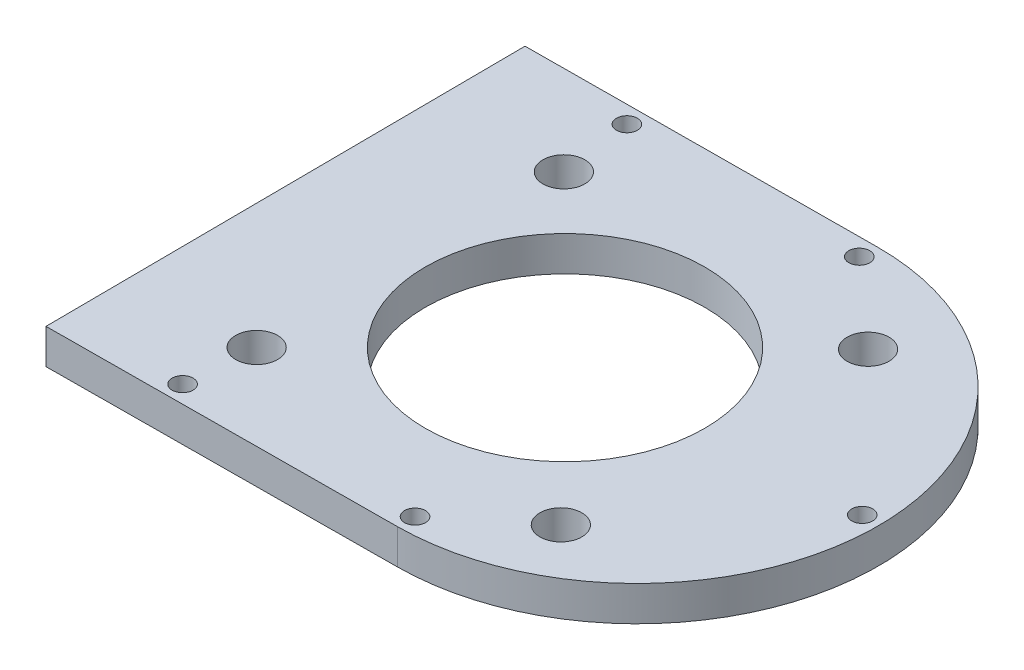
ISO-10303-21;
HEADER;
FILE_DESCRIPTION(('STEP AP214'),'2;1');
FILE_NAME('part.step','',(''),(''),'','','');
FILE_SCHEMA(('AUTOMOTIVE_DESIGN { 1 0 10303 214 1 1 1 1 }'));
ENDSEC;
DATA;
#1=APPLICATION_CONTEXT('core data for automotive mechanical design processes');
#2=APPLICATION_PROTOCOL_DEFINITION('international standard','automotive_design',2000,#1);
#3=PRODUCT_CONTEXT('',#1,'mechanical');
#4=PRODUCT('Part','Part','',(#3));
#5=PRODUCT_RELATED_PRODUCT_CATEGORY('part','',(#4));
#6=PRODUCT_DEFINITION_FORMATION('','',#4);
#7=PRODUCT_DEFINITION_CONTEXT('part definition',#1,'design');
#8=PRODUCT_DEFINITION('design','',#6,#7);
#9=PRODUCT_DEFINITION_SHAPE('','',#8);
#10=(LENGTH_UNIT() NAMED_UNIT(*) SI_UNIT(.MILLI.,.METRE.));
#11=(NAMED_UNIT(*) PLANE_ANGLE_UNIT() SI_UNIT($,.RADIAN.));
#12=(NAMED_UNIT(*) SI_UNIT($,.STERADIAN.) SOLID_ANGLE_UNIT());
#13=UNCERTAINTY_MEASURE_WITH_UNIT(LENGTH_MEASURE(1.E-05),#10,'distance_accuracy_value','');
#14=(GEOMETRIC_REPRESENTATION_CONTEXT(3) GLOBAL_UNCERTAINTY_ASSIGNED_CONTEXT((#13)) GLOBAL_UNIT_ASSIGNED_CONTEXT((#10,
#11,#12)) REPRESENTATION_CONTEXT('',''));
#15=CARTESIAN_POINT('',(0.,0.,0.));
#16=DIRECTION('',(0.,0.,1.));
#17=DIRECTION('',(1.,0.,0.));
#18=AXIS2_PLACEMENT_3D('',#15,#16,#17);
#19=CARTESIAN_POINT('',(1.24525927725289,5.,191.486792966765));
#20=DIRECTION('',(-0.00650297040088788,0.,-0.999978855464437));
#21=DIRECTION('',(-0.999978855464437,0.,0.00650297040088788));
#22=AXIS2_PLACEMENT_3D('',#19,#20,#21);
#23=PLANE('',#22);
#24=DIRECTION('',(0.999978855464437,0.,-0.00650297040088788));
#25=VECTOR('',#24,1.);
#26=CARTESIAN_POINT('',(1.24525927725289,0.,191.486792966765));
#27=LINE('',#26,#25);
#28=CARTESIAN_POINT('',(154.714766749302,0.,190.48876419938));
#29=VERTEX_POINT('',#28);
#30=CARTESIAN_POINT('',(204.713709522523,0.,190.163615679336));
#31=VERTEX_POINT('',#30);
#32=EDGE_CURVE('E130',#29,#31,#27,.T.);
#33=ORIENTED_EDGE('',*,*,#32,.T.);
#34=DIRECTION('',(0.,-1.,0.));
#35=VECTOR('',#34,1.);
#36=CARTESIAN_POINT('',(204.713709522523,5.,190.163615679336));
#37=LINE('',#36,#35);
#38=CARTESIAN_POINT('',(204.713709522523,5.,190.163615679336));
#39=VERTEX_POINT('',#38);
#40=EDGE_CURVE('E11',#39,#31,#37,.T.);
#41=ORIENTED_EDGE('',*,*,#40,.F.);
#42=DIRECTION('',(0.999978855464437,0.,-0.00650297040088788));
#43=VECTOR('',#42,1.);
#44=CARTESIAN_POINT('',(1.24525927725289,5.,191.486792966765));
#45=LINE('',#44,#43);
#46=CARTESIAN_POINT('',(154.714766749302,5.,190.48876419938));
#47=VERTEX_POINT('',#46);
#48=EDGE_CURVE('E88',#47,#39,#45,.T.);
#49=ORIENTED_EDGE('',*,*,#48,.F.);
#50=DIRECTION('',(0.,-1.,0.));
#51=VECTOR('',#50,1.);
#52=CARTESIAN_POINT('',(154.714766749302,5.,190.48876419938));
#53=LINE('',#52,#51);
#54=EDGE_CURVE('E114',#47,#29,#53,.T.);
#55=ORIENTED_EDGE('',*,*,#54,.T.);
#56=EDGE_LOOP('',(#33,#41,#49,#55));
#57=FACE_BOUND('',#56,.T.);
#58=ADVANCED_FACE('F35',(#57),#23,.F.);
#59=CARTESIAN_POINT('',(204.489357043693,5.,155.664345165813));
#60=DIRECTION('',(0.,-1.,0.));
#61=DIRECTION('',(0.,0.,-1.));
#62=AXIS2_PLACEMENT_3D('',#59,#60,#61);
#63=CYLINDRICAL_SURFACE('',#62,34.5);
#64=CARTESIAN_POINT('',(204.489357043693,0.,155.664345165813));
#65=DIRECTION('',(0.,1.,0.));
#66=DIRECTION('',(0.,0.,1.));
#67=AXIS2_PLACEMENT_3D('',#64,#65,#66);
#68=CIRCLE('',#67,34.5);
#69=CARTESIAN_POINT('',(204.265004564862,0.,121.16507465229));
#70=VERTEX_POINT('',#69);
#71=EDGE_CURVE('E92',#31,#70,#68,.T.);
#72=ORIENTED_EDGE('',*,*,#71,.T.);
#73=DIRECTION('',(0.,-1.,0.));
#74=VECTOR('',#73,1.);
#75=CARTESIAN_POINT('',(204.265004564862,5.,121.16507465229));
#76=LINE('',#75,#74);
#77=CARTESIAN_POINT('',(204.265004564862,5.,121.16507465229));
#78=VERTEX_POINT('',#77);
#79=EDGE_CURVE('E44',#78,#70,#76,.T.);
#80=ORIENTED_EDGE('',*,*,#79,.F.);
#81=CARTESIAN_POINT('',(204.489357043693,5.,155.664345165813));
#82=DIRECTION('',(0.,1.,0.));
#83=DIRECTION('',(0.,0.,1.));
#84=AXIS2_PLACEMENT_3D('',#81,#82,#83);
#85=CIRCLE('',#84,34.5);
#86=EDGE_CURVE('E82',#39,#78,#85,.T.);
#87=ORIENTED_EDGE('',*,*,#86,.F.);
#88=ORIENTED_EDGE('',*,*,#40,.T.);
#89=EDGE_LOOP('',(#72,#80,#87,#88));
#90=FACE_BOUND('',#89,.T.);
#91=ADVANCED_FACE('F91',(#90),#63,.T.);
#92=CARTESIAN_POINT('',(0.796554319591557,5.,122.488251939719));
#93=DIRECTION('',(0.00650297040088732,0.,0.999978855464437));
#94=DIRECTION('',(0.999978855464437,0.,-0.00650297040088732));
#95=AXIS2_PLACEMENT_3D('',#92,#93,#94);
#96=PLANE('',#95);
#97=DIRECTION('',(-0.999978855464437,0.,0.00650297040088732));
#98=VECTOR('',#97,1.);
#99=CARTESIAN_POINT('',(0.796554319591557,0.,122.488251939719));
#100=LINE('',#99,#98);
#101=CARTESIAN_POINT('',(154.26606179164,0.,121.490223172334));
#102=VERTEX_POINT('',#101);
#103=EDGE_CURVE('E69',#70,#102,#100,.T.);
#104=ORIENTED_EDGE('',*,*,#103,.T.);
#105=DIRECTION('',(0.,-1.,0.));
#106=VECTOR('',#105,1.);
#107=CARTESIAN_POINT('',(154.26606179164,5.,121.490223172334));
#108=LINE('',#107,#106);
#109=CARTESIAN_POINT('',(154.26606179164,5.,121.490223172334));
#110=VERTEX_POINT('',#109);
#111=EDGE_CURVE('E93',#110,#102,#108,.T.);
#112=ORIENTED_EDGE('',*,*,#111,.F.);
#113=DIRECTION('',(-0.999978855464437,0.,0.00650297040088732));
#114=VECTOR('',#113,1.);
#115=CARTESIAN_POINT('',(0.796554319591557,5.,122.488251939719));
#116=LINE('',#115,#114);
#117=EDGE_CURVE('E86',#78,#110,#116,.T.);
#118=ORIENTED_EDGE('',*,*,#117,.F.);
#119=ORIENTED_EDGE('',*,*,#79,.T.);
#120=EDGE_LOOP('',(#104,#112,#118,#119));
#121=FACE_BOUND('',#120,.T.);
#122=ADVANCED_FACE('F94',(#121),#96,.F.);
#123=CARTESIAN_POINT('',(194.489996123589,5.,155.99022315691));
#124=DIRECTION('',(0.,-1.,0.));
#125=DIRECTION('',(0.,0.,-1.));
#126=AXIS2_PLACEMENT_3D('',#123,#124,#125);
#127=CYLINDRICAL_SURFACE('',#126,19.9999999999999);
#128=CARTESIAN_POINT('',(194.489996123589,5.,155.99022315691));
#129=DIRECTION('',(0.,1.,0.));
#130=DIRECTION('',(0.,0.,1.));
#131=AXIS2_PLACEMENT_3D('',#128,#129,#130);
#132=CIRCLE('',#131,19.9999999999999);
#133=CARTESIAN_POINT('',(194.489996123589,5.,175.990223156909));
#134=VERTEX_POINT('',#133);
#135=EDGE_CURVE('E108',#134,#134,#132,.T.);
#136=ORIENTED_EDGE('',*,*,#135,.T.);
#137=EDGE_LOOP('',(#136));
#138=FACE_BOUND('',#137,.T.);
#139=CARTESIAN_POINT('',(194.489996123589,0.,155.99022315691));
#140=DIRECTION('',(0.,1.,0.));
#141=DIRECTION('',(0.,0.,1.));
#142=AXIS2_PLACEMENT_3D('',#139,#140,#141);
#143=CIRCLE('',#142,19.9999999999999);
#144=CARTESIAN_POINT('',(194.489996123589,0.,175.990223156909));
#145=VERTEX_POINT('',#144);
#146=EDGE_CURVE('E145',#145,#145,#143,.T.);
#147=ORIENTED_EDGE('',*,*,#146,.F.);
#148=EDGE_LOOP('',(#147));
#149=FACE_BOUND('',#148,.T.);
#150=ADVANCED_FACE('F239',(#138,#149),#127,.F.);
#151=CARTESIAN_POINT('',(216.155888878294,5.,178.252189217533));
#152=DIRECTION('',(0.,-1.,0.));
#153=DIRECTION('',(0.,0.,-1.));
#154=AXIS2_PLACEMENT_3D('',#151,#152,#153);
#155=CYLINDRICAL_SURFACE('',#154,3.00000000000002);
#156=CARTESIAN_POINT('',(216.155888878294,5.,178.252189217533));
#157=DIRECTION('',(0.,1.,0.));
#158=DIRECTION('',(0.,0.,1.));
#159=AXIS2_PLACEMENT_3D('',#156,#157,#158);
#160=CIRCLE('',#159,3.00000000000002);
#161=CARTESIAN_POINT('',(216.155888878294,5.,181.252189217533));
#162=VERTEX_POINT('',#161);
#163=EDGE_CURVE('E105',#162,#162,#160,.T.);
#164=ORIENTED_EDGE('',*,*,#163,.T.);
#165=EDGE_LOOP('',(#164));
#166=FACE_BOUND('',#165,.T.);
#167=CARTESIAN_POINT('',(216.155888878294,0.,178.252189217533));
#168=DIRECTION('',(0.,1.,0.));
#169=DIRECTION('',(0.,0.,1.));
#170=AXIS2_PLACEMENT_3D('',#167,#168,#169);
#171=CIRCLE('',#170,3.00000000000002);
#172=CARTESIAN_POINT('',(216.155888878294,0.,181.252189217533));
#173=VERTEX_POINT('',#172);
#174=EDGE_CURVE('E142',#173,#173,#171,.T.);
#175=ORIENTED_EDGE('',*,*,#174,.F.);
#176=EDGE_LOOP('',(#175));
#177=FACE_BOUND('',#176,.T.);
#178=ADVANCED_FACE('F242',(#166,#177),#155,.F.);
#179=CARTESIAN_POINT('',(172.405716262186,5.,178.036597107159));
#180=DIRECTION('',(0.,-1.,0.));
#181=DIRECTION('',(0.,0.,-1.));
#182=AXIS2_PLACEMENT_3D('',#179,#180,#181);
#183=CYLINDRICAL_SURFACE('',#182,3.00000000000005);
#184=CARTESIAN_POINT('',(172.405716262186,5.,178.036597107159));
#185=DIRECTION('',(0.,1.,0.));
#186=DIRECTION('',(0.,0.,1.));
#187=AXIS2_PLACEMENT_3D('',#184,#185,#186);
#188=CIRCLE('',#187,3.00000000000005);
#189=CARTESIAN_POINT('',(172.405716262186,5.,181.036597107159));
#190=VERTEX_POINT('',#189);
#191=EDGE_CURVE('E102',#190,#190,#188,.T.);
#192=ORIENTED_EDGE('',*,*,#191,.T.);
#193=EDGE_LOOP('',(#192));
#194=FACE_BOUND('',#193,.T.);
#195=CARTESIAN_POINT('',(172.405716262186,0.,178.036597107159));
#196=DIRECTION('',(0.,1.,0.));
#197=DIRECTION('',(0.,0.,1.));
#198=AXIS2_PLACEMENT_3D('',#195,#196,#197);
#199=CIRCLE('',#198,3.00000000000005);
#200=CARTESIAN_POINT('',(172.405716262186,0.,181.036597107159));
#201=VERTEX_POINT('',#200);
#202=EDGE_CURVE('E139',#201,#201,#199,.T.);
#203=ORIENTED_EDGE('',*,*,#202,.F.);
#204=EDGE_LOOP('',(#203));
#205=FACE_BOUND('',#204,.T.);
#206=ADVANCED_FACE('F246',(#194,#205),#183,.F.);
#207=CARTESIAN_POINT('',(172.621308372561,5.,134.286424491051));
#208=DIRECTION('',(0.,-1.,0.));
#209=DIRECTION('',(0.,0.,-1.));
#210=AXIS2_PLACEMENT_3D('',#207,#208,#209);
#211=CYLINDRICAL_SURFACE('',#210,2.99999999999999);
#212=CARTESIAN_POINT('',(172.621308372561,5.,134.286424491051));
#213=DIRECTION('',(0.,1.,0.));
#214=DIRECTION('',(0.,0.,1.));
#215=AXIS2_PLACEMENT_3D('',#212,#213,#214);
#216=CIRCLE('',#215,2.99999999999999);
#217=CARTESIAN_POINT('',(172.621308372561,5.,137.286424491051));
#218=VERTEX_POINT('',#217);
#219=EDGE_CURVE('E96',#218,#218,#216,.T.);
#220=ORIENTED_EDGE('',*,*,#219,.T.);
#221=EDGE_LOOP('',(#220));
#222=FACE_BOUND('',#221,.T.);
#223=CARTESIAN_POINT('',(172.621308372561,0.,134.286424491051));
#224=DIRECTION('',(0.,1.,0.));
#225=DIRECTION('',(0.,0.,1.));
#226=AXIS2_PLACEMENT_3D('',#223,#224,#225);
#227=CIRCLE('',#226,2.99999999999999);
#228=CARTESIAN_POINT('',(172.621308372561,0.,137.286424491051));
#229=VERTEX_POINT('',#228);
#230=EDGE_CURVE('E136',#229,#229,#227,.T.);
#231=ORIENTED_EDGE('',*,*,#230,.F.);
#232=EDGE_LOOP('',(#231));
#233=FACE_BOUND('',#232,.T.);
#234=ADVANCED_FACE('F250',(#222,#233),#211,.F.);
#235=CARTESIAN_POINT('',(153.469507472049,5.,-0.998028767384308));
#236=DIRECTION('',(0.999978855464437,0.,-0.00650297040088768));
#237=DIRECTION('',(-0.00650297040088768,0.,-0.999978855464437));
#238=AXIS2_PLACEMENT_3D('',#235,#236,#237);
#239=PLANE('',#238);
#240=DIRECTION('',(0.00650297040088768,0.,0.999978855464437));
#241=VECTOR('',#240,1.);
#242=CARTESIAN_POINT('',(153.469507472049,0.,-0.998028767384308));
#243=LINE('',#242,#241);
#244=EDGE_CURVE('E75',#102,#29,#243,.T.);
#245=ORIENTED_EDGE('',*,*,#244,.T.);
#246=ORIENTED_EDGE('',*,*,#54,.F.);
#247=DIRECTION('',(0.00650297040088768,0.,0.999978855464437));
#248=VECTOR('',#247,1.);
#249=CARTESIAN_POINT('',(153.469507472049,5.,-0.998028767384308));
#250=LINE('',#249,#248);
#251=EDGE_CURVE('E52',#110,#47,#250,.T.);
#252=ORIENTED_EDGE('',*,*,#251,.F.);
#253=ORIENTED_EDGE('',*,*,#111,.T.);
#254=EDGE_LOOP('',(#245,#246,#252,#253));
#255=FACE_BOUND('',#254,.T.);
#256=ADVANCED_FACE('F153',(#255),#239,.F.);
#257=CARTESIAN_POINT('',(171.231953450462,5.,123.879945010611));
#258=DIRECTION('',(0.,-1.,0.));
#259=DIRECTION('',(0.,0.,-1.));
#260=AXIS2_PLACEMENT_3D('',#257,#258,#259);
#261=CYLINDRICAL_SURFACE('',#260,1.50000000000003);
#262=CARTESIAN_POINT('',(171.231953450462,5.,123.879945010611));
#263=DIRECTION('',(0.,1.,0.));
#264=DIRECTION('',(0.,0.,1.));
#265=AXIS2_PLACEMENT_3D('',#262,#263,#264);
#266=CIRCLE('',#265,1.50000000000003);
#267=CARTESIAN_POINT('',(171.231953450462,5.,125.379945010611));
#268=VERTEX_POINT('',#267);
#269=EDGE_CURVE('E159',#268,#268,#266,.T.);
#270=ORIENTED_EDGE('',*,*,#269,.T.);
#271=EDGE_LOOP('',(#270));
#272=FACE_BOUND('',#271,.T.);
#273=CARTESIAN_POINT('',(171.231953450462,0.,123.879945010611));
#274=DIRECTION('',(0.,1.,0.));
#275=DIRECTION('',(0.,0.,1.));
#276=AXIS2_PLACEMENT_3D('',#273,#274,#275);
#277=CIRCLE('',#276,1.50000000000003);
#278=CARTESIAN_POINT('',(171.231953450462,0.,125.379945010611));
#279=VERTEX_POINT('',#278);
#280=EDGE_CURVE('E127',#279,#279,#277,.T.);
#281=ORIENTED_EDGE('',*,*,#280,.F.);
#282=EDGE_LOOP('',(#281));
#283=FACE_BOUND('',#282,.T.);
#284=ADVANCED_FACE('F189',(#272,#283),#261,.F.);
#285=CARTESIAN_POINT('',(204.281261990864,5.,123.665021790951));
#286=DIRECTION('',(0.,-1.,0.));
#287=DIRECTION('',(0.,0.,-1.));
#288=AXIS2_PLACEMENT_3D('',#285,#286,#287);
#289=CYLINDRICAL_SURFACE('',#288,1.50000000000003);
#290=CARTESIAN_POINT('',(204.281261990864,5.,123.665021790951));
#291=DIRECTION('',(0.,1.,0.));
#292=DIRECTION('',(0.,0.,1.));
#293=AXIS2_PLACEMENT_3D('',#290,#291,#292);
#294=CIRCLE('',#293,1.50000000000003);
#295=CARTESIAN_POINT('',(204.281261990864,5.,125.165021790951));
#296=VERTEX_POINT('',#295);
#297=EDGE_CURVE('E161',#296,#296,#294,.T.);
#298=ORIENTED_EDGE('',*,*,#297,.T.);
#299=EDGE_LOOP('',(#298));
#300=FACE_BOUND('',#299,.T.);
#301=CARTESIAN_POINT('',(204.281261990864,0.,123.665021790951));
#302=DIRECTION('',(0.,1.,0.));
#303=DIRECTION('',(0.,0.,1.));
#304=AXIS2_PLACEMENT_3D('',#301,#302,#303);
#305=CIRCLE('',#304,1.50000000000003);
#306=CARTESIAN_POINT('',(204.281261990864,0.,125.165021790951));
#307=VERTEX_POINT('',#306);
#308=EDGE_CURVE('E124',#307,#307,#305,.T.);
#309=ORIENTED_EDGE('',*,*,#308,.F.);
#310=EDGE_LOOP('',(#309));
#311=FACE_BOUND('',#310,.T.);
#312=ADVANCED_FACE('F192',(#300,#311),#289,.F.);
#313=CARTESIAN_POINT('',(236.488680418555,5.,155.456250112985));
#314=DIRECTION('',(0.,-1.,0.));
#315=DIRECTION('',(0.,0.,-1.));
#316=AXIS2_PLACEMENT_3D('',#313,#314,#315);
#317=CYLINDRICAL_SURFACE('',#316,1.50000000000002);
#318=CARTESIAN_POINT('',(236.488680418555,5.,155.456250112985));
#319=DIRECTION('',(0.,1.,0.));
#320=DIRECTION('',(0.,0.,1.));
#321=AXIS2_PLACEMENT_3D('',#318,#319,#320);
#322=CIRCLE('',#321,1.50000000000002);
#323=CARTESIAN_POINT('',(236.488680418555,5.,156.956250112985));
#324=VERTEX_POINT('',#323);
#325=EDGE_CURVE('E166',#324,#324,#322,.T.);
#326=ORIENTED_EDGE('',*,*,#325,.T.);
#327=EDGE_LOOP('',(#326));
#328=FACE_BOUND('',#327,.T.);
#329=CARTESIAN_POINT('',(236.488680418555,0.,155.456250112985));
#330=DIRECTION('',(0.,1.,0.));
#331=DIRECTION('',(0.,0.,1.));
#332=AXIS2_PLACEMENT_3D('',#329,#330,#331);
#333=CIRCLE('',#332,1.50000000000002);
#334=CARTESIAN_POINT('',(236.488680418555,0.,156.956250112985));
#335=VERTEX_POINT('',#334);
#336=EDGE_CURVE('E121',#335,#335,#333,.T.);
#337=ORIENTED_EDGE('',*,*,#336,.F.);
#338=EDGE_LOOP('',(#337));
#339=FACE_BOUND('',#338,.T.);
#340=ADVANCED_FACE('F213',(#328,#339),#317,.F.);
#341=CARTESIAN_POINT('',(171.648143556119,5.,187.878591760335));
#342=DIRECTION('',(0.,-1.,0.));
#343=DIRECTION('',(0.,0.,-1.));
#344=AXIS2_PLACEMENT_3D('',#341,#342,#343);
#345=CYLINDRICAL_SURFACE('',#344,1.50000000000002);
#346=CARTESIAN_POINT('',(171.648143556119,5.,187.878591760335));
#347=DIRECTION('',(0.,1.,0.));
#348=DIRECTION('',(0.,0.,1.));
#349=AXIS2_PLACEMENT_3D('',#346,#347,#348);
#350=CIRCLE('',#349,1.50000000000002);
#351=CARTESIAN_POINT('',(171.648143556119,5.,189.378591760335));
#352=VERTEX_POINT('',#351);
#353=EDGE_CURVE('E169',#352,#352,#350,.T.);
#354=ORIENTED_EDGE('',*,*,#353,.T.);
#355=EDGE_LOOP('',(#354));
#356=FACE_BOUND('',#355,.T.);
#357=CARTESIAN_POINT('',(171.648143556119,0.,187.878591760335));
#358=DIRECTION('',(0.,1.,0.));
#359=DIRECTION('',(0.,0.,1.));
#360=AXIS2_PLACEMENT_3D('',#357,#358,#359);
#361=CIRCLE('',#360,1.50000000000002);
#362=CARTESIAN_POINT('',(171.648143556119,0.,189.378591760335));
#363=VERTEX_POINT('',#362);
#364=EDGE_CURVE('E118',#363,#363,#361,.T.);
#365=ORIENTED_EDGE('',*,*,#364,.F.);
#366=EDGE_LOOP('',(#365));
#367=FACE_BOUND('',#366,.T.);
#368=ADVANCED_FACE('F216',(#356,#367),#345,.F.);
#369=CARTESIAN_POINT('',(204.697452096521,5.,187.663668540675));
#370=DIRECTION('',(0.,-1.,0.));
#371=DIRECTION('',(0.,0.,-1.));
#372=AXIS2_PLACEMENT_3D('',#369,#370,#371);
#373=CYLINDRICAL_SURFACE('',#372,1.50000000000002);
#374=CARTESIAN_POINT('',(204.697452096521,5.,187.663668540675));
#375=DIRECTION('',(0.,1.,0.));
#376=DIRECTION('',(0.,0.,1.));
#377=AXIS2_PLACEMENT_3D('',#374,#375,#376);
#378=CIRCLE('',#377,1.50000000000002);
#379=CARTESIAN_POINT('',(204.697452096521,5.,189.163668540675));
#380=VERTEX_POINT('',#379);
#381=EDGE_CURVE('E151',#380,#380,#378,.T.);
#382=ORIENTED_EDGE('',*,*,#381,.T.);
#383=EDGE_LOOP('',(#382));
#384=FACE_BOUND('',#383,.T.);
#385=CARTESIAN_POINT('',(204.697452096521,0.,187.663668540675));
#386=DIRECTION('',(0.,1.,0.));
#387=DIRECTION('',(0.,0.,1.));
#388=AXIS2_PLACEMENT_3D('',#385,#386,#387);
#389=CIRCLE('',#388,1.50000000000002);
#390=CARTESIAN_POINT('',(204.697452096521,0.,189.163668540675));
#391=VERTEX_POINT('',#390);
#392=EDGE_CURVE('E115',#391,#391,#389,.T.);
#393=ORIENTED_EDGE('',*,*,#392,.F.);
#394=EDGE_LOOP('',(#393));
#395=FACE_BOUND('',#394,.T.);
#396=ADVANCED_FACE('F37',(#384,#395),#373,.F.);
#397=CARTESIAN_POINT('',(216.371480988668,5.,134.502016601426));
#398=DIRECTION('',(0.,-1.,0.));
#399=DIRECTION('',(0.,0.,-1.));
#400=AXIS2_PLACEMENT_3D('',#397,#398,#399);
#401=CYLINDRICAL_SURFACE('',#400,3.00000000000002);
#402=CARTESIAN_POINT('',(216.371480988668,5.,134.502016601426));
#403=DIRECTION('',(0.,1.,0.));
#404=DIRECTION('',(0.,0.,1.));
#405=AXIS2_PLACEMENT_3D('',#402,#403,#404);
#406=CIRCLE('',#405,3.00000000000002);
#407=CARTESIAN_POINT('',(216.371480988668,5.,137.502016601426));
#408=VERTEX_POINT('',#407);
#409=EDGE_CURVE('E111',#408,#408,#406,.T.);
#410=ORIENTED_EDGE('',*,*,#409,.T.);
#411=EDGE_LOOP('',(#410));
#412=FACE_BOUND('',#411,.T.);
#413=CARTESIAN_POINT('',(216.371480988668,0.,134.502016601426));
#414=DIRECTION('',(0.,1.,0.));
#415=DIRECTION('',(0.,0.,1.));
#416=AXIS2_PLACEMENT_3D('',#413,#414,#415);
#417=CIRCLE('',#416,3.00000000000002);
#418=CARTESIAN_POINT('',(216.371480988668,0.,137.502016601426));
#419=VERTEX_POINT('',#418);
#420=EDGE_CURVE('E148',#419,#419,#417,.T.);
#421=ORIENTED_EDGE('',*,*,#420,.F.);
#422=EDGE_LOOP('',(#421));
#423=FACE_BOUND('',#422,.T.);
#424=ADVANCED_FACE('F179',(#412,#423),#401,.F.);
#425=CARTESIAN_POINT('',(0.,5.,0.));
#426=DIRECTION('',(0.,1.,0.));
#427=DIRECTION('',(0.,0.,1.));
#428=AXIS2_PLACEMENT_3D('',#425,#426,#427);
#429=PLANE('',#428);
#430=ORIENTED_EDGE('',*,*,#381,.F.);
#431=EDGE_LOOP('',(#430));
#432=FACE_BOUND('',#431,.T.);
#433=ORIENTED_EDGE('',*,*,#353,.F.);
#434=EDGE_LOOP('',(#433));
#435=FACE_BOUND('',#434,.T.);
#436=ORIENTED_EDGE('',*,*,#325,.F.);
#437=EDGE_LOOP('',(#436));
#438=FACE_BOUND('',#437,.T.);
#439=ORIENTED_EDGE('',*,*,#297,.F.);
#440=EDGE_LOOP('',(#439));
#441=FACE_BOUND('',#440,.T.);
#442=ORIENTED_EDGE('',*,*,#269,.F.);
#443=EDGE_LOOP('',(#442));
#444=FACE_BOUND('',#443,.T.);
#445=ORIENTED_EDGE('',*,*,#48,.T.);
#446=ORIENTED_EDGE('',*,*,#86,.T.);
#447=ORIENTED_EDGE('',*,*,#117,.T.);
#448=ORIENTED_EDGE('',*,*,#251,.T.);
#449=EDGE_LOOP('',(#445,#446,#447,#448));
#450=FACE_BOUND('',#449,.T.);
#451=ORIENTED_EDGE('',*,*,#219,.F.);
#452=EDGE_LOOP('',(#451));
#453=FACE_BOUND('',#452,.T.);
#454=ORIENTED_EDGE('',*,*,#191,.F.);
#455=EDGE_LOOP('',(#454));
#456=FACE_BOUND('',#455,.T.);
#457=ORIENTED_EDGE('',*,*,#163,.F.);
#458=EDGE_LOOP('',(#457));
#459=FACE_BOUND('',#458,.T.);
#460=ORIENTED_EDGE('',*,*,#135,.F.);
#461=EDGE_LOOP('',(#460));
#462=FACE_BOUND('',#461,.T.);
#463=ORIENTED_EDGE('',*,*,#409,.F.);
#464=EDGE_LOOP('',(#463));
#465=FACE_BOUND('',#464,.T.);
#466=ADVANCED_FACE('F83',(#432,#435,#438,#441,#444,#450,#453,#456,#459,#462,#465),#429,.T.);
#467=CARTESIAN_POINT('',(0.,0.,0.));
#468=DIRECTION('',(0.,1.,0.));
#469=DIRECTION('',(0.,0.,1.));
#470=AXIS2_PLACEMENT_3D('',#467,#468,#469);
#471=PLANE('',#470);
#472=ORIENTED_EDGE('',*,*,#392,.T.);
#473=EDGE_LOOP('',(#472));
#474=FACE_BOUND('',#473,.T.);
#475=ORIENTED_EDGE('',*,*,#364,.T.);
#476=EDGE_LOOP('',(#475));
#477=FACE_BOUND('',#476,.T.);
#478=ORIENTED_EDGE('',*,*,#336,.T.);
#479=EDGE_LOOP('',(#478));
#480=FACE_BOUND('',#479,.T.);
#481=ORIENTED_EDGE('',*,*,#308,.T.);
#482=EDGE_LOOP('',(#481));
#483=FACE_BOUND('',#482,.T.);
#484=ORIENTED_EDGE('',*,*,#280,.T.);
#485=EDGE_LOOP('',(#484));
#486=FACE_BOUND('',#485,.T.);
#487=ORIENTED_EDGE('',*,*,#32,.F.);
#488=ORIENTED_EDGE('',*,*,#244,.F.);
#489=ORIENTED_EDGE('',*,*,#103,.F.);
#490=ORIENTED_EDGE('',*,*,#71,.F.);
#491=EDGE_LOOP('',(#487,#488,#489,#490));
#492=FACE_BOUND('',#491,.T.);
#493=ORIENTED_EDGE('',*,*,#230,.T.);
#494=EDGE_LOOP('',(#493));
#495=FACE_BOUND('',#494,.T.);
#496=ORIENTED_EDGE('',*,*,#202,.T.);
#497=EDGE_LOOP('',(#496));
#498=FACE_BOUND('',#497,.T.);
#499=ORIENTED_EDGE('',*,*,#174,.T.);
#500=EDGE_LOOP('',(#499));
#501=FACE_BOUND('',#500,.T.);
#502=ORIENTED_EDGE('',*,*,#146,.T.);
#503=EDGE_LOOP('',(#502));
#504=FACE_BOUND('',#503,.T.);
#505=ORIENTED_EDGE('',*,*,#420,.T.);
#506=EDGE_LOOP('',(#505));
#507=FACE_BOUND('',#506,.T.);
#508=ADVANCED_FACE('F156',(#474,#477,#480,#483,#486,#492,#495,#498,#501,#504,#507),#471,.F.);
#509=CLOSED_SHELL('',(#58,#91,#122,#150,#178,#206,#234,#256,#284,#312,#340,#368,#396,#424,#466,#508));
#510=MANIFOLD_SOLID_BREP('B2',#509);
#511=ADVANCED_BREP_SHAPE_REPRESENTATION('',(#18,#510),#14);
#512=SHAPE_DEFINITION_REPRESENTATION(#9,#511);
ENDSEC;
END-ISO-10303-21;
